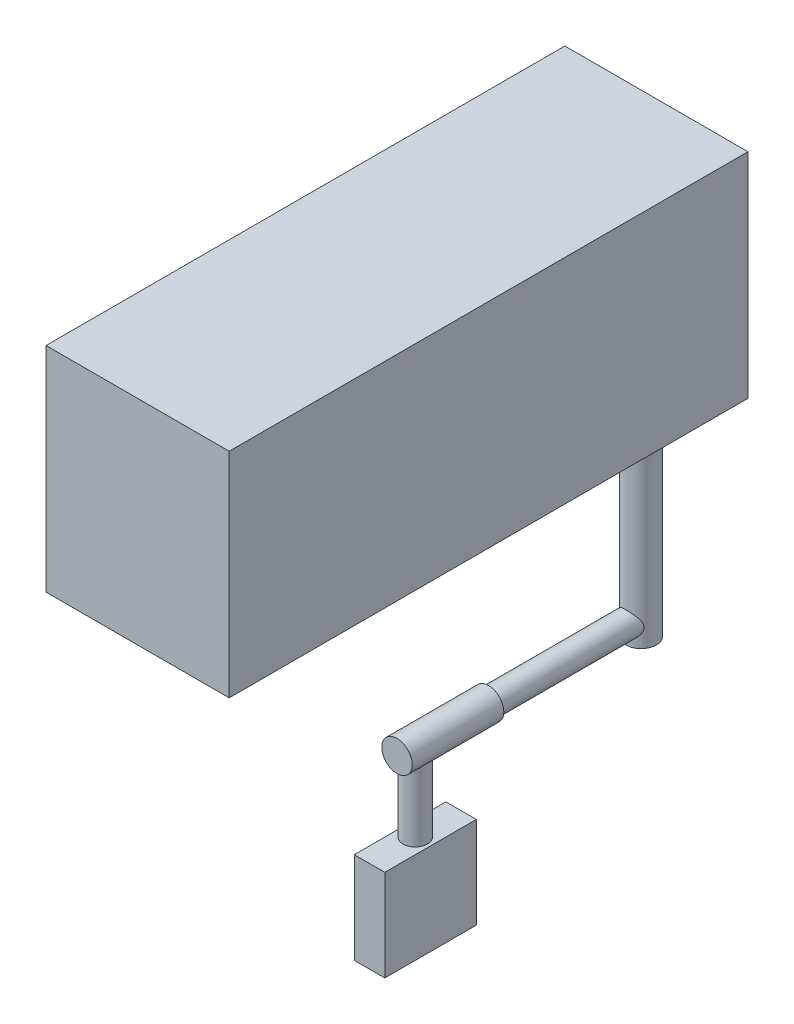
ISO-10303-21;
HEADER;
FILE_DESCRIPTION(('STEP AP214'),'2;1');
FILE_NAME('part.step','',(''),(''),'','','');
FILE_SCHEMA(('AUTOMOTIVE_DESIGN { 1 0 10303 214 1 1 1 1 }'));
ENDSEC;
DATA;
#1=APPLICATION_CONTEXT('core data for automotive mechanical design processes');
#2=APPLICATION_PROTOCOL_DEFINITION('international standard','automotive_design',2000,#1);
#3=PRODUCT_CONTEXT('',#1,'mechanical');
#4=PRODUCT('Part','Part','',(#3));
#5=PRODUCT_RELATED_PRODUCT_CATEGORY('part','',(#4));
#6=PRODUCT_DEFINITION_FORMATION('','',#4);
#7=PRODUCT_DEFINITION_CONTEXT('part definition',#1,'design');
#8=PRODUCT_DEFINITION('design','',#6,#7);
#9=PRODUCT_DEFINITION_SHAPE('','',#8);
#10=(LENGTH_UNIT() NAMED_UNIT(*) SI_UNIT(.MILLI.,.METRE.));
#11=(NAMED_UNIT(*) PLANE_ANGLE_UNIT() SI_UNIT($,.RADIAN.));
#12=(NAMED_UNIT(*) SI_UNIT($,.STERADIAN.) SOLID_ANGLE_UNIT());
#13=UNCERTAINTY_MEASURE_WITH_UNIT(LENGTH_MEASURE(1.E-05),#10,'distance_accuracy_value','');
#14=(GEOMETRIC_REPRESENTATION_CONTEXT(3) GLOBAL_UNCERTAINTY_ASSIGNED_CONTEXT((#13)) GLOBAL_UNIT_ASSIGNED_CONTEXT((#10,
#11,#12)) REPRESENTATION_CONTEXT('',''));
#15=CARTESIAN_POINT('',(0.,0.,0.));
#16=DIRECTION('',(0.,0.,1.));
#17=DIRECTION('',(1.,0.,0.));
#18=AXIS2_PLACEMENT_3D('',#15,#16,#17);
#19=CARTESIAN_POINT('',(0.,6.,80.));
#20=DIRECTION('',(0.,0.,-1.));
#21=DIRECTION('',(-1.,0.,0.));
#22=AXIS2_PLACEMENT_3D('',#19,#20,#21);
#23=CYLINDRICAL_SURFACE('',#22,5.);
#24=CARTESIAN_POINT('',(0.,6.,80.));
#25=DIRECTION('',(0.,0.,1.));
#26=DIRECTION('',(1.,0.,0.));
#27=AXIS2_PLACEMENT_3D('',#24,#25,#26);
#28=CIRCLE('',#27,5.);
#29=CARTESIAN_POINT('',(5.,6.,80.));
#30=VERTEX_POINT('',#29);
#31=EDGE_CURVE('E169',#30,#30,#28,.T.);
#32=ORIENTED_EDGE('',*,*,#31,.F.);
#33=EDGE_LOOP('',(#32));
#34=FACE_BOUND('',#33,.T.);
#35=CARTESIAN_POINT('',(0.,6.,50.));
#36=DIRECTION('',(0.,0.,1.));
#37=DIRECTION('',(1.,0.,0.));
#38=AXIS2_PLACEMENT_3D('',#35,#36,#37);
#39=CIRCLE('',#38,5.);
#40=CARTESIAN_POINT('',(5.,6.,50.));
#41=VERTEX_POINT('',#40);
#42=EDGE_CURVE('E168',#41,#41,#39,.T.);
#43=ORIENTED_EDGE('',*,*,#42,.T.);
#44=EDGE_LOOP('',(#43));
#45=FACE_BOUND('',#44,.T.);
#46=CARTESIAN_POINT('',(0.,0.999999999999999,70.));
#47=CARTESIAN_POINT('',(0.096046389226961,1.00000074992856,70.0000007676539));
#48=CARTESIAN_POINT('',(0.192107536101774,1.00277390821319,70.0034657012846));
#49=CARTESIAN_POINT('',(0.38345699795925,1.01380355864107,70.0172658187929));
#50=CARTESIAN_POINT('',(0.478744876926665,1.02206295260536,70.0276046384607));
#51=CARTESIAN_POINT('',(0.667896097153801,1.04389383672006,70.0549958830148));
#52=CARTESIAN_POINT('',(0.761756856675557,1.05747398365359,70.0720592488998));
#53=CARTESIAN_POINT('',(0.947221840714973,1.08963852945978,70.1126101869622));
#54=CARTESIAN_POINT('',(1.0388250210609,1.10822519822824,70.1361006731936));
#55=CARTESIAN_POINT('',(1.30807557979516,1.17064893516717,70.2153329942576));
#56=CARTESIAN_POINT('',(1.48159866642755,1.22132413949302,70.2800510338738));
#57=CARTESIAN_POINT('',(1.81389737735533,1.33729323773426,70.4302503559933));
#58=CARTESIAN_POINT('',(1.97267295492965,1.40258717796054,70.5157317042729));
#59=CARTESIAN_POINT('',(2.2248639292531,1.52087178867235,70.6736868645101));
#60=CARTESIAN_POINT('',(2.32274021976622,1.57095599647352,70.7413473643456));
#61=CARTESIAN_POINT('',(2.51087921896427,1.6748379788989,70.8840057339144));
#62=CARTESIAN_POINT('',(2.60114198151348,1.7286357272456,70.9590035517295));
#63=CARTESIAN_POINT('',(2.77417073320715,1.83892611237122,71.1159636745199));
#64=CARTESIAN_POINT('',(2.85691378598488,1.89542624136862,71.1979459007938));
#65=CARTESIAN_POINT('',(3.01451382114098,2.00973973566812,71.3682397983687));
#66=CARTESIAN_POINT('',(3.08937383375153,2.06755258589642,71.4565490154843));
#67=CARTESIAN_POINT('',(3.23229007730865,2.18412066597537,71.6407406318536));
#68=CARTESIAN_POINT('',(3.30022025313705,2.24287636581282,71.7367205726384));
#69=CARTESIAN_POINT('',(3.42776995071922,2.35887060911854,71.9349832474423));
#70=CARTESIAN_POINT('',(3.48738684516028,2.41610866834714,72.0372679593474));
#71=CARTESIAN_POINT('',(3.59782503741137,2.52699593438768,72.247927510792));
#72=CARTESIAN_POINT('',(3.64867015372864,2.58065460917791,72.3562847649317));
#73=CARTESIAN_POINT('',(3.74117870293954,2.68212534901716,72.5793826997049));
#74=CARTESIAN_POINT('',(3.78284998029722,2.72994239349309,72.6941178206929));
#75=CARTESIAN_POINT('',(3.86171422877733,2.82329789334592,72.947710426075));
#76=CARTESIAN_POINT('',(3.89730775139992,2.86742836805689,73.0876106993092));
#77=CARTESIAN_POINT('',(3.95346969661507,2.93859930065222,73.3744381132964));
#78=CARTESIAN_POINT('',(3.97407505769532,2.96568175123062,73.5213470214841));
#79=CARTESIAN_POINT('',(3.99879637912877,2.99831609062409,73.8203813312704));
#80=CARTESIAN_POINT('',(4.00276700147492,3.00367819500678,73.9725410473948));
#81=CARTESIAN_POINT('',(3.99338954471176,2.99120062029292,74.2754117079387));
#82=CARTESIAN_POINT('',(3.98002680850315,2.97334130511836,74.4261213175347));
#83=CARTESIAN_POINT('',(3.93390695839725,2.91358529834909,74.7444399948995));
#84=CARTESIAN_POINT('',(3.89843994454065,2.86836179125633,74.9109987003219));
#85=CARTESIAN_POINT('',(3.80888715528762,2.76005217310181,75.2330884824285));
#86=CARTESIAN_POINT('',(3.75474623305133,2.6969132542133,75.3885852321079));
#87=CARTESIAN_POINT('',(3.64593083160692,2.57772367257378,75.6497837139866));
#88=CARTESIAN_POINT('',(3.59488537286136,2.52394654561732,75.7581007886365));
#89=CARTESIAN_POINT('',(3.48415594475938,2.41296814896922,75.9684490944712));
#90=CARTESIAN_POINT('',(3.4244679828778,2.3557653039205,76.0704773892381));
#91=CARTESIAN_POINT('',(3.29671153239118,2.23979373479724,76.2683872018107));
#92=CARTESIAN_POINT('',(3.22863333111249,2.18102325883224,76.3642613966167));
#93=CARTESIAN_POINT('',(3.08431402129279,2.06354666106961,76.5496673500318));
#94=CARTESIAN_POINT('',(3.008074255065,2.00484053028887,76.6392001475829));
#95=CARTESIAN_POINT('',(2.84534419554468,1.88729295068074,76.8140101235963));
#96=CARTESIAN_POINT('',(2.75863401138676,1.82849000876997,76.8991090406098));
#97=CARTESIAN_POINT('',(2.57673993184823,1.71374522220171,77.061913093756));
#98=CARTESIAN_POINT('',(2.48155479066099,1.65780380009287,77.1396171393685));
#99=CARTESIAN_POINT('',(2.28307653193502,1.5502516770457,77.286757305373));
#100=CARTESIAN_POINT('',(2.17980247969453,1.49863135265625,77.3562119507816));
#101=CARTESIAN_POINT('',(1.96536649556136,1.400952495128,77.4861249415168));
#102=CARTESIAN_POINT('',(1.85420815715074,1.35489145372656,77.5465873468848));
#103=CARTESIAN_POINT('',(1.57560055871037,1.25154505550212,77.6810867237149));
#104=CARTESIAN_POINT('',(1.40425498615809,1.19777204519658,77.7500220999001));
#105=CARTESIAN_POINT('',(1.1383735489335,1.13044991235364,77.8357293521389));
#106=CARTESIAN_POINT('',(1.04825004232715,1.11022935062312,77.8613525356034));
#107=CARTESIAN_POINT('',(0.865540559816958,1.07460862574269,77.9063630582772));
#108=CARTESIAN_POINT('',(0.772955756713235,1.05920620989625,77.9257533117744));
#109=CARTESIAN_POINT('',(0.585412597793578,1.03348155384366,77.9580805109284));
#110=CARTESIAN_POINT('',(0.490443672775562,1.02318896309976,77.9709797988717));
#111=CARTESIAN_POINT('',(0.29943003181316,1.00805486911274,77.9899309236985));
#112=CARTESIAN_POINT('',(0.203385773695847,1.00321112893417,77.9959855705412));
#113=CARTESIAN_POINT('',(0.010978919459465,0.99908674616463,78.0011418998756));
#114=CARTESIAN_POINT('',(-0.0853836963466778,0.999806454303868,78.0002431440118));
#115=CARTESIAN_POINT('',(-0.277564076275608,1.0067822706449,77.9915194220691));
#116=CARTESIAN_POINT('',(-0.373381868010141,1.0130380957128,77.9836948101995));
#117=CARTESIAN_POINT('',(-0.643376202108252,1.03846981592038,77.9518293985393));
#118=CARTESIAN_POINT('',(-0.816090326301464,1.06407482859287,77.9197003154007));
#119=CARTESIAN_POINT('',(-1.15270281500891,1.13164785847918,77.8342569725143));
#120=CARTESIAN_POINT('',(-1.31659854682902,1.17362073174102,77.7809364255526));
#121=CARTESIAN_POINT('',(-1.64246254984508,1.27420356054902,77.6516988659432));
#122=CARTESIAN_POINT('',(-1.80368475821038,1.33368189326515,77.5745883227446));
#123=CARTESIAN_POINT('',(-2.11082248971799,1.4643273975473,77.4022758020824));
#124=CARTESIAN_POINT('',(-2.25673724895782,1.53549515200758,77.3070729224052));
#125=CARTESIAN_POINT('',(-2.55850389862995,1.70012630046435,77.0815513267087));
#126=CARTESIAN_POINT('',(-2.71101415405663,1.79526061827146,76.9479966072965));
#127=CARTESIAN_POINT('',(-2.99307397629785,1.99113002644471,76.6612260866735));
#128=CARTESIAN_POINT('',(-3.12255559915956,2.09188057492385,76.5079543318471));
#129=CARTESIAN_POINT('',(-3.3113697315352,2.25251729684895,76.2471311101697));
#130=CARTESIAN_POINT('',(-3.37827483148946,2.31290513119751,76.1452788111766));
#131=CARTESIAN_POINT('',(-3.50310004274977,2.43129168464243,75.934755484519));
#132=CARTESIAN_POINT('',(-3.56101538768256,2.48928912446285,75.8260808822576));
#133=CARTESIAN_POINT('',(-3.66717546897677,2.60033772972667,75.6022214884681));
#134=CARTESIAN_POINT('',(-3.71545356957103,2.65340560766969,75.487060991757));
#135=CARTESIAN_POINT('',(-3.80178930968625,2.7518192250263,75.2499190098447));
#136=CARTESIAN_POINT('',(-3.83985955607519,2.79717446410246,75.1279461651777));
#137=CARTESIAN_POINT('',(-3.90720331142185,2.87961159133612,74.8678265775588));
#138=CARTESIAN_POINT('',(-3.93559119413989,2.91580566519269,74.729154680385));
#139=CARTESIAN_POINT('',(-3.97757811274649,2.97013256863467,74.4463247642843));
#140=CARTESIAN_POINT('',(-3.99121445660239,2.98831095169795,74.302181544095));
#141=CARTESIAN_POINT('',(-4.00264117924986,3.00350526656863,74.0113026041563));
#142=CARTESIAN_POINT('',(-4.00034641568718,3.0004074908226,73.864557141841));
#143=CARTESIAN_POINT('',(-3.97993037076083,2.97338455687426,73.5740315637251));
#144=CARTESIAN_POINT('',(-3.96178399745348,2.94942637836937,73.4302565194056));
#145=CARTESIAN_POINT('',(-3.90415501142107,2.87585850907538,73.1107866882603));
#146=CARTESIAN_POINT('',(-3.86018501383221,2.82101501769939,72.9371548312483));
#147=CARTESIAN_POINT('',(-3.75216313748643,2.69422166051332,72.6027320434362));
#148=CARTESIAN_POINT('',(-3.68805209792865,2.62222155257259,72.4419807156193));
#149=CARTESIAN_POINT('',(-3.56189718857297,2.49017853783497,72.1756497161867));
#150=CARTESIAN_POINT('',(-3.50405339937575,2.4322260250564,72.06697526241));
#151=CARTESIAN_POINT('',(-3.37929393177912,2.31384197050323,71.8563190174512));
#152=CARTESIAN_POINT('',(-3.31237456346969,2.25340942741465,71.7543399736195));
#153=CARTESIAN_POINT('',(-3.16965616428094,2.13191542079343,71.5570272137113));
#154=CARTESIAN_POINT('',(-3.09384874323815,2.07085341345297,71.4616999143588));
#155=CARTESIAN_POINT('',(-2.93352249741482,1.94974836810419,71.2779962989172));
#156=CARTESIAN_POINT('',(-2.84900504963137,1.88970517077151,71.1896188879803));
#157=CARTESIAN_POINT('',(-2.67014072502328,1.77128817990643,71.019091751671));
#158=CARTESIAN_POINT('',(-2.57567862987895,1.71294696852389,70.9370398517826));
#159=CARTESIAN_POINT('',(-2.3779763873343,1.60020653964008,70.7811370075282));
#160=CARTESIAN_POINT('',(-2.2747347878796,1.54580797698553,70.7072874244309));
#161=CARTESIAN_POINT('',(-2.05999159425826,1.44252473229356,70.568863427576));
#162=CARTESIAN_POINT('',(-1.94851057794582,1.39362703480994,70.5042670166469));
#163=CARTESIAN_POINT('',(-1.71770987957313,1.30267329639315,70.3852598955594));
#164=CARTESIAN_POINT('',(-1.59839505588528,1.26061307022294,70.3308429514203));
#165=CARTESIAN_POINT('',(-1.31004257426752,1.17158168149355,70.216438184424));
#166=CARTESIAN_POINT('',(-1.13806652982962,1.12793321059058,70.1610196372283));
#167=CARTESIAN_POINT('',(-0.873484823698106,1.07606454429446,70.095475973429));
#168=CARTESIAN_POINT('',(-0.784257476388458,1.06104851354442,70.0765663971458));
#169=CARTESIAN_POINT('',(-0.604069275434088,1.03579295742865,70.0448202192519));
#170=CARTESIAN_POINT('',(-0.51310921224975,1.02555130586383,70.0319809142995));
#171=CARTESIAN_POINT('',(-0.351776460100415,1.0118968003969,70.0148786444011));
#172=CARTESIAN_POINT('',(-0.281625512428803,1.00744150465322,70.0093051659039));
#173=CARTESIAN_POINT('',(-0.140985741127526,1.00149249974691,70.0018651495667));
#174=CARTESIAN_POINT('',(-0.0704968458136538,0.999999449561839,69.9999994365516));
#175=CARTESIAN_POINT('',(0.,0.999999999999999,70.));
#176=B_SPLINE_CURVE_WITH_KNOTS('',3,(#46,#47,#48,#49,#50,#51,#52,#53,#54,#55,#56,#57,#58,#59,
#60,#61,#62,#63,#64,#65,#66,#67,#68,#69,#70,#71,#72,#73,#74,#75,#76,#77,#78,#79,#80,#81,#82,#83,
#84,#85,#86,#87,#88,#89,#90,#91,#92,#93,#94,#95,#96,#97,#98,#99,#100,#101,#102,#103,#104,#105,
#106,#107,#108,#109,#110,#111,#112,#113,#114,#115,#116,#117,#118,#119,#120,#121,#122,#123,#124,
#125,#126,#127,#128,#129,#130,#131,#132,#133,#134,#135,#136,#137,#138,#139,#140,#141,#142,#143,
#144,#145,#146,#147,#148,#149,#150,#151,#152,#153,#154,#155,#156,#157,#158,#159,#160,#161,#162,
#163,#164,#165,#166,#167,#168,#169,#170,#171,#172,#173,#174,#175),.UNSPECIFIED.,.T.,.F.,(4,2,2,
2,2,2,2,2,2,2,2,2,2,2,2,2,2,2,2,2,2,2,2,2,2,2,2,2,2,2,2,2,2,2,2,2,2,2,2,2,2,2,2,2,2,2,2,2,2,2,2,
2,2,2,2,2,2,2,2,2,2,2,2,2,4),(0.,0.288062758667621,0.576278003111145,0.864964129651047,
1.15378136390405,1.72709009312658,2.30040063856698,2.68722645474263,3.07404953396829,
3.46201544535746,3.84983167444716,4.24376978737867,4.63783211891323,5.03080698743563,
5.42344451024555,5.87474837856559,6.3249361999052,6.77904922175816,7.23354649231945,
7.75923125238318,8.28648192165707,8.67980074282273,9.07330184627998,9.46726282862526,
9.8611591163995,10.2656076837237,10.6701158028798,11.0736976518486,11.47709672477,
12.0514034064526,12.33867331582,12.625808712343,12.91459127094,13.2032552313198,
13.4919373897648,13.7806047849778,14.3106110383656,14.8407746547939,15.4037260006337,
15.9667054266294,16.6361816844955,17.3076015388323,17.7152021542885,18.1230181470312,
18.5293968097802,18.9352712520425,19.3719136407628,19.8074491211246,20.2453140663444,
20.6838733784181,21.2427370784729,21.8032579383455,22.2109901693714,22.6188886741923,
23.0271753760053,23.4353976291478,23.8490189589147,24.2627088316333,24.6753983284759,
25.0878342578456,25.642744266039,25.9197834242687,26.1966990890725,26.4080865235327,
26.6195209777156),.UNSPECIFIED.);
#177=CARTESIAN_POINT('',(0.,0.999999999999999,70.));
#178=VERTEX_POINT('',#177);
#179=EDGE_CURVE('E11',#178,#178,#176,.T.);
#180=ORIENTED_EDGE('',*,*,#179,.F.);
#181=EDGE_LOOP('',(#180));
#182=FACE_BOUND('',#181,.T.);
#183=ADVANCED_FACE('F32',(#34,#45,#182),#23,.T.);
#184=CARTESIAN_POINT('',(0.,70.,0.));
#185=DIRECTION('',(0.,-1.,0.));
#186=DIRECTION('',(0.,0.,-1.));
#187=AXIS2_PLACEMENT_3D('',#184,#185,#186);
#188=CYLINDRICAL_SURFACE('',#187,5.);
#189=CARTESIAN_POINT('',(0.,70.,0.));
#190=DIRECTION('',(0.,1.,0.));
#191=DIRECTION('',(0.,0.,1.));
#192=AXIS2_PLACEMENT_3D('',#189,#190,#191);
#193=CIRCLE('',#192,5.);
#194=CARTESIAN_POINT('',(0.,70.,5.));
#195=VERTEX_POINT('',#194);
#196=EDGE_CURVE('E178',#195,#195,#193,.T.);
#197=ORIENTED_EDGE('',*,*,#196,.F.);
#198=EDGE_LOOP('',(#197));
#199=FACE_BOUND('',#198,.T.);
#200=CARTESIAN_POINT('',(0.,0.,0.));
#201=DIRECTION('',(0.,1.,0.));
#202=DIRECTION('',(0.,0.,1.));
#203=AXIS2_PLACEMENT_3D('',#200,#201,#202);
#204=CIRCLE('',#203,5.);
#205=CARTESIAN_POINT('',(0.,0.,5.));
#206=VERTEX_POINT('',#205);
#207=EDGE_CURVE('E177',#206,#206,#204,.T.);
#208=ORIENTED_EDGE('',*,*,#207,.T.);
#209=EDGE_LOOP('',(#208));
#210=FACE_BOUND('',#209,.T.);
#211=CARTESIAN_POINT('',(-4.,6.,3.));
#212=CARTESIAN_POINT('',(-3.99999906153736,5.92488723612757,3.00000216897706));
#213=CARTESIAN_POINT('',(-3.9978772461753,5.84974512169484,3.00283772099951));
#214=CARTESIAN_POINT('',(-3.9894472679785,5.7000914331377,3.01402583978567));
#215=CARTESIAN_POINT('',(-3.98313625047582,5.62558032409134,3.0223821685803));
#216=CARTESIAN_POINT('',(-3.95807727295162,5.40352073306123,3.05522921920832));
#217=CARTESIAN_POINT('',(-3.93320424396426,5.25775589097472,3.08749551829531));
#218=CARTESIAN_POINT('',(-3.85777127536566,4.9247320703939,3.18155216304267));
#219=CARTESIAN_POINT('',(-3.80127986277752,4.74071923707104,3.24971322017135));
#220=CARTESIAN_POINT('',(-3.66572012951488,4.38805945634076,3.40189644530756));
#221=CARTESIAN_POINT('',(-3.58658817896458,4.21945760795963,3.48596308623154));
#222=CARTESIAN_POINT('',(-3.43637278534429,3.94889741948875,3.63299455510025));
#223=CARTESIAN_POINT('',(-3.37076459378184,3.8428274270577,3.69414368347801));
#224=CARTESIAN_POINT('',(-3.23028207033377,3.6376390851311,3.81759266309352));
#225=CARTESIAN_POINT('',(-3.15540441260616,3.53852325085631,3.87989292049062));
#226=CARTESIAN_POINT('',(-2.99663184861433,3.34753014483071,4.00378958470973));
#227=CARTESIAN_POINT('',(-2.91274636380755,3.25564548090626,4.06538665380558));
#228=CARTESIAN_POINT('',(-2.73598294461541,3.07938698148919,4.1863923788989));
#229=CARTESIAN_POINT('',(-2.64310382389854,2.99501413969035,4.24580074475847));
#230=CARTESIAN_POINT('',(-2.38958702931893,2.78583586545782,4.39576497816678));
#231=CARTESIAN_POINT('',(-2.22188522507707,2.66735960040732,4.48348070331291));
#232=CARTESIAN_POINT('',(-1.86487183658862,2.45525593334017,4.64331594269541));
#233=CARTESIAN_POINT('',(-1.67559449748563,2.36158991633117,4.71545966061736));
#234=CARTESIAN_POINT('',(-1.31063780833639,2.2165765830982,4.82831023596969));
#235=CARTESIAN_POINT('',(-1.13770814774397,2.16083554176219,4.87221400973622));
#236=CARTESIAN_POINT('',(-0.782375130146824,2.07300193894518,4.94171895740111));
#237=CARTESIAN_POINT('',(-0.599977012805125,2.04089644424418,4.96733014065903));
#238=CARTESIAN_POINT('',(-0.230096932996537,2.00228399397581,4.99815918603462));
#239=CARTESIAN_POINT('',(-0.0425996130134286,1.99586566291391,5.00330644418758));
#240=CARTESIAN_POINT('',(0.330832803126789,2.00932842145091,4.99253877415278));
#241=CARTESIAN_POINT('',(0.516767826586741,2.02921072813164,4.97662287125135));
#242=CARTESIAN_POINT('',(0.871367119528873,2.09213598454442,4.92656730161909));
#243=CARTESIAN_POINT('',(1.04042037317327,2.13385763711365,4.89346809374314));
#244=CARTESIAN_POINT('',(1.36834372900709,2.23739046530193,4.81208987661317));
#245=CARTESIAN_POINT('',(1.52721124956009,2.29920671010816,4.76380703714183));
#246=CARTESIAN_POINT('',(1.84705463504236,2.44720139814914,4.6497244388944));
#247=CARTESIAN_POINT('',(2.00675938549036,2.5351530322565,4.58268531292501));
#248=CARTESIAN_POINT('',(2.30941782762205,2.72907571895576,4.43788087321013));
#249=CARTESIAN_POINT('',(2.4523620660043,2.83505685878936,4.36010955958914));
#250=CARTESIAN_POINT('',(2.74853042703121,3.08612373752091,4.18107021951004));
#251=CARTESIAN_POINT('',(2.89780217491636,3.23476722774106,4.07826288579636));
#252=CARTESIAN_POINT('',(3.17076769972647,3.55251180797032,3.8698475585256));
#253=CARTESIAN_POINT('',(3.29442988804259,3.72163775994985,3.76423628533182));
#254=CARTESIAN_POINT('',(3.50457057042853,4.0624403892844,3.56882635257453));
#255=CARTESIAN_POINT('',(3.59348348213152,4.23230187262223,3.47848449125888));
#256=CARTESIAN_POINT('',(3.74778213755155,4.58873294105501,3.31164211528199));
#257=CARTESIAN_POINT('',(3.81321930924474,4.77526487184244,3.23511152965085));
#258=CARTESIAN_POINT('',(3.90124400044661,5.10558318631859,3.12787610334287));
#259=CARTESIAN_POINT('',(3.93080589266452,5.24522559208198,3.09031204063763));
#260=CARTESIAN_POINT('',(3.97493954411982,5.53036048146621,3.03334609209689));
#261=CARTESIAN_POINT('',(3.98954472407251,5.67583916410135,3.01390372218814));
#262=CARTESIAN_POINT('',(4.00259995644497,5.96972649809808,2.99655581152985));
#263=CARTESIAN_POINT('',(4.00095637919488,6.11814720647635,2.99877509004064));
#264=CARTESIAN_POINT('',(3.98145195095297,6.41209561507503,3.02460910255619));
#265=CARTESIAN_POINT('',(3.96356821696024,6.55761893701122,3.04825402601148));
#266=CARTESIAN_POINT('',(3.90662980025043,6.87812188422511,3.12103026774741));
#267=CARTESIAN_POINT('',(3.86334682887901,7.05117767007011,3.17511484339329));
#268=CARTESIAN_POINT('',(3.7568227830305,7.38460065498101,3.30045577188711));
#269=CARTESIAN_POINT('',(3.69352220593005,7.54492821833795,3.37176316858109));
#270=CARTESIAN_POINT('',(3.56873529200274,7.81092552210887,3.50285579501049));
#271=CARTESIAN_POINT('',(3.5113936535288,7.91964530364436,3.56053707787215));
#272=CARTESIAN_POINT('',(3.38766369294499,8.13041737979328,3.67845509899156));
#273=CARTESIAN_POINT('',(3.32127165613201,8.23246691104777,3.73869287952637));
#274=CARTESIAN_POINT('',(3.17963685728911,8.42995611875223,3.859872019447));
#275=CARTESIAN_POINT('',(3.10438543197557,8.52538917788069,3.92081401406668));
#276=CARTESIAN_POINT('',(2.9452042144371,8.70934721579986,4.04175247615808));
#277=CARTESIAN_POINT('',(2.86127578119157,8.79787327255512,4.10174909000274));
#278=CARTESIAN_POINT('',(2.68353213742299,8.96885093952303,4.22021627080502));
#279=CARTESIAN_POINT('',(2.5895923964421,9.05119722338575,4.27865261127786));
#280=CARTESIAN_POINT('',(2.39294409088258,9.2077427948928,4.39166054074383));
#281=CARTESIAN_POINT('',(2.29023415844021,9.28194080753191,4.44623152443021));
#282=CARTESIAN_POINT('',(2.07659269983668,9.42110502049679,4.54992450745379));
#283=CARTESIAN_POINT('',(1.96568453999992,9.48609602729697,4.5990610672003));
#284=CARTESIAN_POINT('',(1.73599312724424,9.60598282457441,4.69058814238978));
#285=CARTESIAN_POINT('',(1.61721438534433,9.66088433090296,4.73298247555985));
#286=CARTESIAN_POINT('',(1.32913962146261,9.77693416615782,4.82322056507458));
#287=CARTESIAN_POINT('',(1.15683679137342,9.83342216125891,4.86768700006943));
#288=CARTESIAN_POINT('',(0.802710516835256,9.92287685298778,4.93844243001732));
#289=CARTESIAN_POINT('',(0.620894454329601,9.95586150517093,4.96474530068643));
#290=CARTESIAN_POINT('',(0.251928169863231,9.99638225985935,4.99709091896648));
#291=CARTESIAN_POINT('',(0.0647609739930265,10.0038255067255,5.00305974169112));
#292=CARTESIAN_POINT('',(-0.308260451752373,9.99246788492419,4.99397521901685));
#293=CARTESIAN_POINT('',(-0.494114588250191,9.97366516830221,4.97892039336181));
#294=CARTESIAN_POINT('',(-0.848969594728794,9.91279269274,4.9304799780731));
#295=CARTESIAN_POINT('',(-1.01834018003763,9.87202131706675,4.89811800019639));
#296=CARTESIAN_POINT('',(-1.34704122291858,9.7702931775047,4.81810404518646));
#297=CARTESIAN_POINT('',(-1.50636906741201,9.7093311856992,4.77044810811758));
#298=CARTESIAN_POINT('',(-1.82676698607757,9.56325105620565,4.65772424604643));
#299=CARTESIAN_POINT('',(-1.98661951413852,9.47641294678162,4.59144870858767));
#300=CARTESIAN_POINT('',(-2.28972858505141,9.2847146944691,4.44806715123531));
#301=CARTESIAN_POINT('',(-2.43297624848929,9.17984498297378,4.37095538500458));
#302=CARTESIAN_POINT('',(-2.72976152486728,8.931410442207,4.19334053560394));
#303=CARTESIAN_POINT('',(-2.87940400752524,8.78431890412568,4.09128024292158));
#304=CARTESIAN_POINT('',(-3.15339914395293,8.46975440470847,3.8840119778562));
#305=CARTESIAN_POINT('',(-3.2777199709751,8.30225621151788,3.7788002325243));
#306=CARTESIAN_POINT('',(-3.43993958125245,8.0435346368876,3.62927982065268));
#307=CARTESIAN_POINT('',(-3.488247591851,7.95998002989855,3.58277064491091));
#308=CARTESIAN_POINT('',(-3.57912761543908,7.78864740992603,3.49198784457615));
#309=CARTESIAN_POINT('',(-3.62169886134499,7.70086883426576,3.44771451944074));
#310=CARTESIAN_POINT('',(-3.74029659813685,7.43132131592966,3.32016981870037));
#311=CARTESIAN_POINT('',(-3.80747088284747,7.24292483286532,3.24192092894644));
#312=CARTESIAN_POINT('',(-3.89828691275497,6.90766193831876,3.13160451168613));
#313=CARTESIAN_POINT('',(-3.92892882070587,6.76501053305037,3.09272315846936));
#314=CARTESIAN_POINT('',(-3.96316402261262,6.54659167380919,3.04855095693216));
#315=CARTESIAN_POINT('',(-3.97261660358216,6.47314010032986,3.0361918739199));
#316=CARTESIAN_POINT('',(-3.98745340408318,6.32516152890442,3.01668227593599));
#317=CARTESIAN_POINT('',(-3.99284047225642,6.25063532132183,3.00952811408349));
#318=CARTESIAN_POINT('',(-3.99741959341137,6.14661817932196,3.00343793345697));
#319=CARTESIAN_POINT('',(-3.99838660813179,6.11732119338124,3.00215019354812));
#320=CARTESIAN_POINT('',(-3.99967703663994,6.05868430155365,3.00043074741308));
#321=CARTESIAN_POINT('',(-4.00000036663029,6.02934439057613,2.99999915264321));
#322=CARTESIAN_POINT('',(-4.,6.,3.));
#323=B_SPLINE_CURVE_WITH_KNOTS('',3,(#211,#212,#213,#214,#215,#216,#217,#218,#219,#220,#221,
#222,#223,#224,#225,#226,#227,#228,#229,#230,#231,#232,#233,#234,#235,#236,#237,#238,#239,#240,
#241,#242,#243,#244,#245,#246,#247,#248,#249,#250,#251,#252,#253,#254,#255,#256,#257,#258,#259,
#260,#261,#262,#263,#264,#265,#266,#267,#268,#269,#270,#271,#272,#273,#274,#275,#276,#277,#278,
#279,#280,#281,#282,#283,#284,#285,#286,#287,#288,#289,#290,#291,#292,#293,#294,#295,#296,#297,
#298,#299,#300,#301,#302,#303,#304,#305,#306,#307,#308,#309,#310,#311,#312,#313,#314,#315,#316,
#317,#318,#319,#320,#321,#322),.UNSPECIFIED.,.T.,.F.,(4,2,2,2,2,2,2,2,2,2,2,2,2,2,2,2,2,2,2,2,2,
2,2,2,2,2,2,2,2,2,2,2,2,2,2,2,2,2,2,2,2,2,2,2,2,2,2,2,2,2,2,2,2,2,2,4),(0.,0.225303149807231,
0.450759986838273,0.902589537001555,1.51190711853316,2.12295426111056,2.53921883623537,
2.95563320042537,3.37161619465101,3.78765413525725,4.45477512810166,5.12085162154028,
5.67923095322337,6.23730451573862,6.79730186307842,7.35732512562407,7.88682741454582,
8.41646338281239,8.99711927828841,9.57810111704287,10.2788135954479,10.9803852999411,
11.6143729322192,12.2469630912607,12.6881435902171,13.1283361077291,13.5710666035102,
14.0144218930567,14.5705602720657,15.1283675704704,15.5352238321967,15.942247592246,
16.3496727250838,16.7570341440244,17.1702378198688,17.5835060601354,17.9956387441516,
18.4075372242805,18.9651425713465,19.5223214735684,20.0815238628587,20.6407656270703,
21.1700928587455,21.6995572553744,22.2782911959238,22.8573331992422,23.5548944002191,
24.2533270266164,24.5745079263911,24.8957317299052,25.5365329660934,25.9876445768305,
26.2126360623764,26.4374697531347,26.5254777394982,26.6134971823349),.UNSPECIFIED.);
#324=CARTESIAN_POINT('',(-4.,6.,3.));
#325=VERTEX_POINT('',#324);
#326=EDGE_CURVE('E47',#325,#325,#323,.T.);
#327=ORIENTED_EDGE('',*,*,#326,.F.);
#328=EDGE_LOOP('',(#327));
#329=FACE_BOUND('',#328,.T.);
#330=ADVANCED_FACE('F34',(#199,#210,#329),#188,.T.);
#331=CARTESIAN_POINT('',(0.,0.,0.));
#332=DIRECTION('',(0.,1.,0.));
#333=DIRECTION('',(0.,0.,1.));
#334=AXIS2_PLACEMENT_3D('',#331,#332,#333);
#335=PLANE('',#334);
#336=ORIENTED_EDGE('',*,*,#207,.F.);
#337=EDGE_LOOP('',(#336));
#338=FACE_BOUND('',#337,.T.);
#339=ADVANCED_FACE('F191',(#338),#335,.F.);
#340=CARTESIAN_POINT('',(0.,6.,50.));
#341=DIRECTION('',(0.,0.,-1.));
#342=DIRECTION('',(-1.,0.,0.));
#343=AXIS2_PLACEMENT_3D('',#340,#341,#342);
#344=CYLINDRICAL_SURFACE('',#343,4.);
#345=CARTESIAN_POINT('',(0.,6.,50.));
#346=DIRECTION('',(0.,0.,1.));
#347=DIRECTION('',(1.,0.,0.));
#348=AXIS2_PLACEMENT_3D('',#345,#346,#347);
#349=CIRCLE('',#348,4.);
#350=CARTESIAN_POINT('',(4.,6.,50.));
#351=VERTEX_POINT('',#350);
#352=EDGE_CURVE('E172',#351,#351,#349,.T.);
#353=ORIENTED_EDGE('',*,*,#352,.F.);
#354=EDGE_LOOP('',(#353));
#355=FACE_BOUND('',#354,.T.);
#356=ORIENTED_EDGE('',*,*,#326,.T.);
#357=EDGE_LOOP('',(#356));
#358=FACE_BOUND('',#357,.T.);
#359=ADVANCED_FACE('F187',(#355,#358),#344,.T.);
#360=CARTESIAN_POINT('',(0.,6.,80.));
#361=DIRECTION('',(0.,0.,1.));
#362=DIRECTION('',(1.,0.,0.));
#363=AXIS2_PLACEMENT_3D('',#360,#361,#362);
#364=PLANE('',#363);
#365=ORIENTED_EDGE('',*,*,#31,.T.);
#366=EDGE_LOOP('',(#365));
#367=FACE_BOUND('',#366,.T.);
#368=ADVANCED_FACE('F190',(#367),#364,.T.);
#369=CARTESIAN_POINT('',(0.,6.,50.));
#370=DIRECTION('',(0.,0.,1.));
#371=DIRECTION('',(1.,0.,0.));
#372=AXIS2_PLACEMENT_3D('',#369,#370,#371);
#373=PLANE('',#372);
#374=ORIENTED_EDGE('',*,*,#352,.T.);
#375=EDGE_LOOP('',(#374));
#376=FACE_BOUND('',#375,.T.);
#377=ORIENTED_EDGE('',*,*,#42,.F.);
#378=EDGE_LOOP('',(#377));
#379=FACE_BOUND('',#378,.T.);
#380=ADVANCED_FACE('F215',(#376,#379),#373,.F.);
#381=CARTESIAN_POINT('',(0.,5.,74.));
#382=DIRECTION('',(0.,-1.,0.));
#383=DIRECTION('',(0.,0.,-1.));
#384=AXIS2_PLACEMENT_3D('',#381,#382,#383);
#385=CYLINDRICAL_SURFACE('',#384,4.);
#386=CARTESIAN_POINT('',(0.,-20.,74.));
#387=DIRECTION('',(0.,1.,0.));
#388=DIRECTION('',(0.,0.,1.));
#389=AXIS2_PLACEMENT_3D('',#386,#387,#388);
#390=CIRCLE('',#389,4.);
#391=CARTESIAN_POINT('',(0.,-20.,78.));
#392=VERTEX_POINT('',#391);
#393=EDGE_CURVE('E165',#392,#392,#390,.T.);
#394=ORIENTED_EDGE('',*,*,#393,.T.);
#395=EDGE_LOOP('',(#394));
#396=FACE_BOUND('',#395,.T.);
#397=ORIENTED_EDGE('',*,*,#179,.T.);
#398=EDGE_LOOP('',(#397));
#399=FACE_BOUND('',#398,.T.);
#400=ADVANCED_FACE('F212',(#396,#399),#385,.T.);
#401=CARTESIAN_POINT('',(-5.,-50.,89.));
#402=DIRECTION('',(1.,0.,0.));
#403=DIRECTION('',(0.,0.,-1.));
#404=AXIS2_PLACEMENT_3D('',#401,#402,#403);
#405=PLANE('',#404);
#406=DIRECTION('',(0.,0.,-1.));
#407=VECTOR('',#406,1.);
#408=CARTESIAN_POINT('',(-5.,-20.,89.));
#409=LINE('',#408,#407);
#410=CARTESIAN_POINT('',(-5.,-20.,89.));
#411=VERTEX_POINT('',#410);
#412=CARTESIAN_POINT('',(-5.,-20.,59.));
#413=VERTEX_POINT('',#412);
#414=EDGE_CURVE('E139',#411,#413,#409,.T.);
#415=ORIENTED_EDGE('',*,*,#414,.T.);
#416=DIRECTION('',(0.,1.,0.));
#417=VECTOR('',#416,1.);
#418=CARTESIAN_POINT('',(-5.,-50.,59.));
#419=LINE('',#418,#417);
#420=CARTESIAN_POINT('',(-5.,-50.,59.));
#421=VERTEX_POINT('',#420);
#422=EDGE_CURVE('E163',#421,#413,#419,.T.);
#423=ORIENTED_EDGE('',*,*,#422,.F.);
#424=DIRECTION('',(0.,0.,-1.));
#425=VECTOR('',#424,1.);
#426=CARTESIAN_POINT('',(-5.,-50.,89.));
#427=LINE('',#426,#425);
#428=CARTESIAN_POINT('',(-5.,-50.,89.));
#429=VERTEX_POINT('',#428);
#430=EDGE_CURVE('E148',#429,#421,#427,.T.);
#431=ORIENTED_EDGE('',*,*,#430,.F.);
#432=DIRECTION('',(0.,1.,0.));
#433=VECTOR('',#432,1.);
#434=CARTESIAN_POINT('',(-5.,-50.,89.));
#435=LINE('',#434,#433);
#436=EDGE_CURVE('E153',#429,#411,#435,.T.);
#437=ORIENTED_EDGE('',*,*,#436,.T.);
#438=EDGE_LOOP('',(#415,#423,#431,#437));
#439=FACE_BOUND('',#438,.T.);
#440=ADVANCED_FACE('F214',(#439),#405,.F.);
#441=CARTESIAN_POINT('',(-5.,-50.,59.));
#442=DIRECTION('',(0.,0.,1.));
#443=DIRECTION('',(1.,0.,0.));
#444=AXIS2_PLACEMENT_3D('',#441,#442,#443);
#445=PLANE('',#444);
#446=DIRECTION('',(1.,0.,0.));
#447=VECTOR('',#446,1.);
#448=CARTESIAN_POINT('',(-5.,-20.,59.));
#449=LINE('',#448,#447);
#450=CARTESIAN_POINT('',(5.,-20.,59.));
#451=VERTEX_POINT('',#450);
#452=EDGE_CURVE('E142',#413,#451,#449,.T.);
#453=ORIENTED_EDGE('',*,*,#452,.T.);
#454=DIRECTION('',(0.,1.,0.));
#455=VECTOR('',#454,1.);
#456=CARTESIAN_POINT('',(5.,-50.,59.));
#457=LINE('',#456,#455);
#458=CARTESIAN_POINT('',(5.,-50.,59.));
#459=VERTEX_POINT('',#458);
#460=EDGE_CURVE('E161',#459,#451,#457,.T.);
#461=ORIENTED_EDGE('',*,*,#460,.F.);
#462=DIRECTION('',(1.,0.,0.));
#463=VECTOR('',#462,1.);
#464=CARTESIAN_POINT('',(-5.,-50.,59.));
#465=LINE('',#464,#463);
#466=EDGE_CURVE('E87',#421,#459,#465,.T.);
#467=ORIENTED_EDGE('',*,*,#466,.F.);
#468=ORIENTED_EDGE('',*,*,#422,.T.);
#469=EDGE_LOOP('',(#453,#461,#467,#468));
#470=FACE_BOUND('',#469,.T.);
#471=ADVANCED_FACE('F221',(#470),#445,.F.);
#472=CARTESIAN_POINT('',(5.,-50.,89.));
#473=DIRECTION('',(-1.,0.,0.));
#474=DIRECTION('',(0.,0.,1.));
#475=AXIS2_PLACEMENT_3D('',#472,#473,#474);
#476=PLANE('',#475);
#477=DIRECTION('',(0.,0.,1.));
#478=VECTOR('',#477,1.);
#479=CARTESIAN_POINT('',(5.,-20.,89.));
#480=LINE('',#479,#478);
#481=CARTESIAN_POINT('',(5.,-20.,89.));
#482=VERTEX_POINT('',#481);
#483=EDGE_CURVE('E73',#451,#482,#480,.T.);
#484=ORIENTED_EDGE('',*,*,#483,.T.);
#485=DIRECTION('',(0.,1.,0.));
#486=VECTOR('',#485,1.);
#487=CARTESIAN_POINT('',(5.,-50.,89.));
#488=LINE('',#487,#486);
#489=CARTESIAN_POINT('',(5.,-50.,89.));
#490=VERTEX_POINT('',#489);
#491=EDGE_CURVE('E159',#490,#482,#488,.T.);
#492=ORIENTED_EDGE('',*,*,#491,.F.);
#493=DIRECTION('',(0.,0.,1.));
#494=VECTOR('',#493,1.);
#495=CARTESIAN_POINT('',(5.,-50.,89.));
#496=LINE('',#495,#494);
#497=EDGE_CURVE('E151',#459,#490,#496,.T.);
#498=ORIENTED_EDGE('',*,*,#497,.F.);
#499=ORIENTED_EDGE('',*,*,#460,.T.);
#500=EDGE_LOOP('',(#484,#492,#498,#499));
#501=FACE_BOUND('',#500,.T.);
#502=ADVANCED_FACE('F261',(#501),#476,.F.);
#503=CARTESIAN_POINT('',(-5.,-50.,89.));
#504=DIRECTION('',(0.,0.,-1.));
#505=DIRECTION('',(-1.,0.,0.));
#506=AXIS2_PLACEMENT_3D('',#503,#504,#505);
#507=PLANE('',#506);
#508=DIRECTION('',(-1.,0.,0.));
#509=VECTOR('',#508,1.);
#510=CARTESIAN_POINT('',(-5.,-20.,89.));
#511=LINE('',#510,#509);
#512=EDGE_CURVE('E79',#482,#411,#511,.T.);
#513=ORIENTED_EDGE('',*,*,#512,.T.);
#514=ORIENTED_EDGE('',*,*,#436,.F.);
#515=DIRECTION('',(-1.,0.,0.));
#516=VECTOR('',#515,1.);
#517=CARTESIAN_POINT('',(-5.,-50.,89.));
#518=LINE('',#517,#516);
#519=EDGE_CURVE('E55',#490,#429,#518,.T.);
#520=ORIENTED_EDGE('',*,*,#519,.F.);
#521=ORIENTED_EDGE('',*,*,#491,.T.);
#522=EDGE_LOOP('',(#513,#514,#520,#521));
#523=FACE_BOUND('',#522,.T.);
#524=ADVANCED_FACE('F269',(#523),#507,.F.);
#525=CARTESIAN_POINT('',(0.,-50.,0.));
#526=DIRECTION('',(0.,-1.,0.));
#527=DIRECTION('',(0.,0.,-1.));
#528=AXIS2_PLACEMENT_3D('',#525,#526,#527);
#529=PLANE('',#528);
#530=ORIENTED_EDGE('',*,*,#430,.T.);
#531=ORIENTED_EDGE('',*,*,#466,.T.);
#532=ORIENTED_EDGE('',*,*,#497,.T.);
#533=ORIENTED_EDGE('',*,*,#519,.T.);
#534=EDGE_LOOP('',(#530,#531,#532,#533));
#535=FACE_BOUND('',#534,.T.);
#536=ADVANCED_FACE('F278',(#535),#529,.T.);
#537=CARTESIAN_POINT('',(0.,-20.,0.));
#538=DIRECTION('',(0.,-1.,0.));
#539=DIRECTION('',(0.,0.,-1.));
#540=AXIS2_PLACEMENT_3D('',#537,#538,#539);
#541=PLANE('',#540);
#542=ORIENTED_EDGE('',*,*,#393,.F.);
#543=EDGE_LOOP('',(#542));
#544=FACE_BOUND('',#543,.T.);
#545=ORIENTED_EDGE('',*,*,#414,.F.);
#546=ORIENTED_EDGE('',*,*,#512,.F.);
#547=ORIENTED_EDGE('',*,*,#483,.F.);
#548=ORIENTED_EDGE('',*,*,#452,.F.);
#549=EDGE_LOOP('',(#545,#546,#547,#548));
#550=FACE_BOUND('',#549,.T.);
#551=ADVANCED_FACE('F287',(#544,#550),#541,.F.);
#552=CARTESIAN_POINT('',(-40.,140.,-15.));
#553=DIRECTION('',(1.,0.,0.));
#554=DIRECTION('',(0.,0.,-1.));
#555=AXIS2_PLACEMENT_3D('',#552,#553,#554);
#556=PLANE('',#555);
#557=DIRECTION('',(0.,0.,1.));
#558=VECTOR('',#557,1.);
#559=CARTESIAN_POINT('',(-40.,70.,-15.));
#560=LINE('',#559,#558);
#561=CARTESIAN_POINT('',(-40.,70.,-15.));
#562=VERTEX_POINT('',#561);
#563=CARTESIAN_POINT('',(-40.,70.,155.));
#564=VERTEX_POINT('',#563);
#565=EDGE_CURVE('E138',#562,#564,#560,.T.);
#566=ORIENTED_EDGE('',*,*,#565,.T.);
#567=DIRECTION('',(0.,-1.,0.));
#568=VECTOR('',#567,1.);
#569=CARTESIAN_POINT('',(-40.,140.,155.));
#570=LINE('',#569,#568);
#571=CARTESIAN_POINT('',(-40.,140.,155.));
#572=VERTEX_POINT('',#571);
#573=EDGE_CURVE('E118',#572,#564,#570,.T.);
#574=ORIENTED_EDGE('',*,*,#573,.F.);
#575=DIRECTION('',(0.,0.,1.));
#576=VECTOR('',#575,1.);
#577=CARTESIAN_POINT('',(-40.,140.,-15.));
#578=LINE('',#577,#576);
#579=CARTESIAN_POINT('',(-40.,140.,-15.));
#580=VERTEX_POINT('',#579);
#581=EDGE_CURVE('E125',#580,#572,#578,.T.);
#582=ORIENTED_EDGE('',*,*,#581,.F.);
#583=DIRECTION('',(0.,-1.,0.));
#584=VECTOR('',#583,1.);
#585=CARTESIAN_POINT('',(-40.,140.,-15.));
#586=LINE('',#585,#584);
#587=EDGE_CURVE('E367',#580,#562,#586,.T.);
#588=ORIENTED_EDGE('',*,*,#587,.T.);
#589=EDGE_LOOP('',(#566,#574,#582,#588));
#590=FACE_BOUND('',#589,.T.);
#591=ADVANCED_FACE('F136',(#590),#556,.F.);
#592=CARTESIAN_POINT('',(-40.,140.,155.));
#593=DIRECTION('',(0.,0.,-1.));
#594=DIRECTION('',(-1.,0.,0.));
#595=AXIS2_PLACEMENT_3D('',#592,#593,#594);
#596=PLANE('',#595);
#597=DIRECTION('',(1.,0.,0.));
#598=VECTOR('',#597,1.);
#599=CARTESIAN_POINT('',(-40.,70.,155.));
#600=LINE('',#599,#598);
#601=CARTESIAN_POINT('',(20.,70.,155.));
#602=VERTEX_POINT('',#601);
#603=EDGE_CURVE('E358',#564,#602,#600,.T.);
#604=ORIENTED_EDGE('',*,*,#603,.T.);
#605=DIRECTION('',(0.,-1.,0.));
#606=VECTOR('',#605,1.);
#607=CARTESIAN_POINT('',(20.,140.,155.));
#608=LINE('',#607,#606);
#609=CARTESIAN_POINT('',(20.,140.,155.));
#610=VERTEX_POINT('',#609);
#611=EDGE_CURVE('E121',#610,#602,#608,.T.);
#612=ORIENTED_EDGE('',*,*,#611,.F.);
#613=DIRECTION('',(1.,0.,0.));
#614=VECTOR('',#613,1.);
#615=CARTESIAN_POINT('',(-40.,140.,155.));
#616=LINE('',#615,#614);
#617=EDGE_CURVE('E114',#572,#610,#616,.T.);
#618=ORIENTED_EDGE('',*,*,#617,.F.);
#619=ORIENTED_EDGE('',*,*,#573,.T.);
#620=EDGE_LOOP('',(#604,#612,#618,#619));
#621=FACE_BOUND('',#620,.T.);
#622=ADVANCED_FACE('F116',(#621),#596,.F.);
#623=CARTESIAN_POINT('',(20.,140.,-15.));
#624=DIRECTION('',(-1.,0.,0.));
#625=DIRECTION('',(0.,0.,1.));
#626=AXIS2_PLACEMENT_3D('',#623,#624,#625);
#627=PLANE('',#626);
#628=DIRECTION('',(0.,0.,-1.));
#629=VECTOR('',#628,1.);
#630=CARTESIAN_POINT('',(20.,70.,-15.));
#631=LINE('',#630,#629);
#632=CARTESIAN_POINT('',(20.,70.,-15.));
#633=VERTEX_POINT('',#632);
#634=EDGE_CURVE('E360',#602,#633,#631,.T.);
#635=ORIENTED_EDGE('',*,*,#634,.T.);
#636=DIRECTION('',(0.,-1.,0.));
#637=VECTOR('',#636,1.);
#638=CARTESIAN_POINT('',(20.,140.,-15.));
#639=LINE('',#638,#637);
#640=CARTESIAN_POINT('',(20.,140.,-15.));
#641=VERTEX_POINT('',#640);
#642=EDGE_CURVE('E144',#641,#633,#639,.T.);
#643=ORIENTED_EDGE('',*,*,#642,.F.);
#644=DIRECTION('',(0.,0.,-1.));
#645=VECTOR('',#644,1.);
#646=CARTESIAN_POINT('',(20.,140.,-15.));
#647=LINE('',#646,#645);
#648=EDGE_CURVE('E124',#610,#641,#647,.T.);
#649=ORIENTED_EDGE('',*,*,#648,.F.);
#650=ORIENTED_EDGE('',*,*,#611,.T.);
#651=EDGE_LOOP('',(#635,#643,#649,#650));
#652=FACE_BOUND('',#651,.T.);
#653=ADVANCED_FACE('F313',(#652),#627,.F.);
#654=CARTESIAN_POINT('',(-40.,140.,-15.));
#655=DIRECTION('',(0.,0.,1.));
#656=DIRECTION('',(1.,0.,0.));
#657=AXIS2_PLACEMENT_3D('',#654,#655,#656);
#658=PLANE('',#657);
#659=DIRECTION('',(-1.,0.,0.));
#660=VECTOR('',#659,1.);
#661=CARTESIAN_POINT('',(-40.,70.,-15.));
#662=LINE('',#661,#660);
#663=EDGE_CURVE('E134',#633,#562,#662,.T.);
#664=ORIENTED_EDGE('',*,*,#663,.T.);
#665=ORIENTED_EDGE('',*,*,#587,.F.);
#666=DIRECTION('',(-1.,0.,0.));
#667=VECTOR('',#666,1.);
#668=CARTESIAN_POINT('',(-40.,140.,-15.));
#669=LINE('',#668,#667);
#670=EDGE_CURVE('E130',#641,#580,#669,.T.);
#671=ORIENTED_EDGE('',*,*,#670,.F.);
#672=ORIENTED_EDGE('',*,*,#642,.T.);
#673=EDGE_LOOP('',(#664,#665,#671,#672));
#674=FACE_BOUND('',#673,.T.);
#675=ADVANCED_FACE('F322',(#674),#658,.F.);
#676=CARTESIAN_POINT('',(0.,140.,0.));
#677=DIRECTION('',(0.,1.,0.));
#678=DIRECTION('',(0.,0.,1.));
#679=AXIS2_PLACEMENT_3D('',#676,#677,#678);
#680=PLANE('',#679);
#681=ORIENTED_EDGE('',*,*,#581,.T.);
#682=ORIENTED_EDGE('',*,*,#617,.T.);
#683=ORIENTED_EDGE('',*,*,#648,.T.);
#684=ORIENTED_EDGE('',*,*,#670,.T.);
#685=EDGE_LOOP('',(#681,#682,#683,#684));
#686=FACE_BOUND('',#685,.T.);
#687=ADVANCED_FACE('F128',(#686),#680,.T.);
#688=CARTESIAN_POINT('',(0.,70.,0.));
#689=DIRECTION('',(0.,1.,0.));
#690=DIRECTION('',(0.,0.,1.));
#691=AXIS2_PLACEMENT_3D('',#688,#689,#690);
#692=PLANE('',#691);
#693=ORIENTED_EDGE('',*,*,#196,.T.);
#694=EDGE_LOOP('',(#693));
#695=FACE_BOUND('',#694,.T.);
#696=ORIENTED_EDGE('',*,*,#565,.F.);
#697=ORIENTED_EDGE('',*,*,#663,.F.);
#698=ORIENTED_EDGE('',*,*,#634,.F.);
#699=ORIENTED_EDGE('',*,*,#603,.F.);
#700=EDGE_LOOP('',(#696,#697,#698,#699));
#701=FACE_BOUND('',#700,.T.);
#702=ADVANCED_FACE('F341',(#695,#701),#692,.F.);
#703=CLOSED_SHELL('',(#183,#330,#339,#359,#368,#380,#400,#440,#471,#502,#524,#536,#551,#591,
#622,#653,#675,#687,#702));
#704=MANIFOLD_SOLID_BREP('B2',#703);
#705=ADVANCED_BREP_SHAPE_REPRESENTATION('',(#18,#704),#14);
#706=SHAPE_DEFINITION_REPRESENTATION(#9,#705);
ENDSEC;
END-ISO-10303-21;
